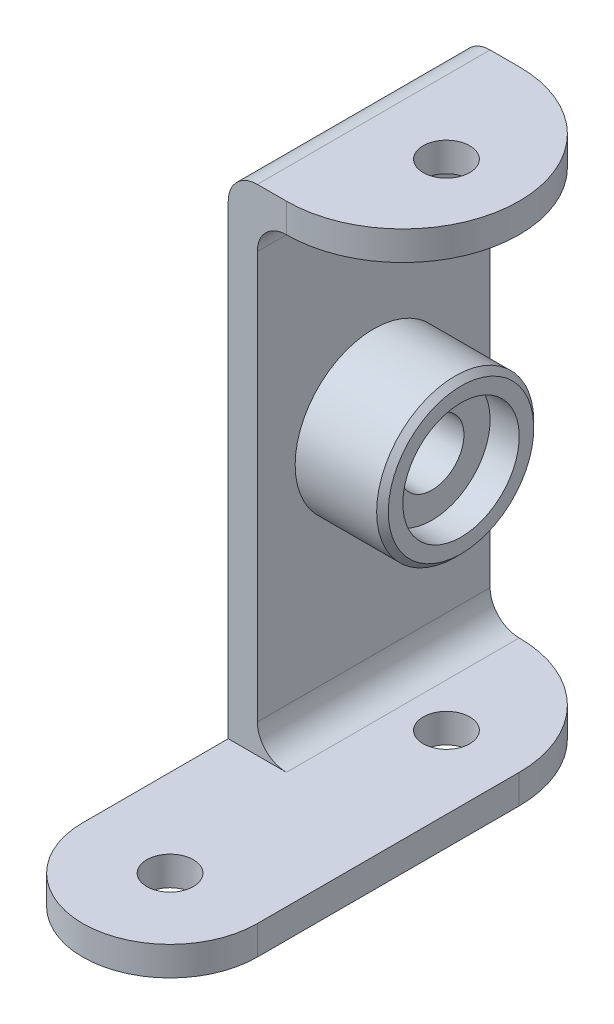
ISO-10303-21;
HEADER;
FILE_DESCRIPTION(('STEP AP214'),'2;1');
FILE_NAME('part.step','',(''),(''),'','','');
FILE_SCHEMA(('AUTOMOTIVE_DESIGN { 1 0 10303 214 1 1 1 1 }'));
ENDSEC;
DATA;
#1=APPLICATION_CONTEXT('core data for automotive mechanical design processes');
#2=APPLICATION_PROTOCOL_DEFINITION('international standard','automotive_design',2000,#1);
#3=PRODUCT_CONTEXT('',#1,'mechanical');
#4=PRODUCT('Part','Part','',(#3));
#5=PRODUCT_RELATED_PRODUCT_CATEGORY('part','',(#4));
#6=PRODUCT_DEFINITION_FORMATION('','',#4);
#7=PRODUCT_DEFINITION_CONTEXT('part definition',#1,'design');
#8=PRODUCT_DEFINITION('design','',#6,#7);
#9=PRODUCT_DEFINITION_SHAPE('','',#8);
#10=(LENGTH_UNIT() NAMED_UNIT(*) SI_UNIT(.MILLI.,.METRE.));
#11=(NAMED_UNIT(*) PLANE_ANGLE_UNIT() SI_UNIT($,.RADIAN.));
#12=(NAMED_UNIT(*) SI_UNIT($,.STERADIAN.) SOLID_ANGLE_UNIT());
#13=UNCERTAINTY_MEASURE_WITH_UNIT(LENGTH_MEASURE(1.E-05),#10,'distance_accuracy_value','');
#14=(GEOMETRIC_REPRESENTATION_CONTEXT(3) GLOBAL_UNCERTAINTY_ASSIGNED_CONTEXT((#13)) GLOBAL_UNIT_ASSIGNED_CONTEXT((#10,
#11,#12)) REPRESENTATION_CONTEXT('',''));
#15=CARTESIAN_POINT('',(0.,0.,0.));
#16=DIRECTION('',(0.,0.,1.));
#17=DIRECTION('',(1.,0.,0.));
#18=AXIS2_PLACEMENT_3D('',#15,#16,#17);
#19=CARTESIAN_POINT('',(-30.,0.,0.));
#20=DIRECTION('',(1.,0.,0.));
#21=DIRECTION('',(0.,-1.,0.));
#22=AXIS2_PLACEMENT_3D('',#19,#20,#21);
#23=CYLINDRICAL_SURFACE('',#22,5.5);
#24=CARTESIAN_POINT('',(-30.,0.,0.));
#25=DIRECTION('',(-1.,0.,0.));
#26=DIRECTION('',(0.,-1.,0.));
#27=AXIS2_PLACEMENT_3D('',#24,#25,#26);
#28=CIRCLE('',#27,5.5);
#29=CARTESIAN_POINT('',(-30.,-5.5,0.));
#30=VERTEX_POINT('',#29);
#31=EDGE_CURVE('E196',#30,#30,#28,.T.);
#32=ORIENTED_EDGE('',*,*,#31,.T.);
#33=EDGE_LOOP('',(#32));
#34=FACE_BOUND('',#33,.T.);
#35=CARTESIAN_POINT('',(-15.,0.,0.));
#36=DIRECTION('',(-1.,0.,0.));
#37=DIRECTION('',(0.,-1.,0.));
#38=AXIS2_PLACEMENT_3D('',#35,#36,#37);
#39=CIRCLE('',#38,5.5);
#40=CARTESIAN_POINT('',(-15.,-5.5,0.));
#41=VERTEX_POINT('',#40);
#42=EDGE_CURVE('E49',#41,#41,#39,.F.);
#43=ORIENTED_EDGE('',*,*,#42,.T.);
#44=EDGE_LOOP('',(#43));
#45=FACE_BOUND('',#44,.T.);
#46=ADVANCED_FACE('F45',(#34,#45),#23,.F.);
#47=CARTESIAN_POINT('',(-15.,-40.,45.));
#48=DIRECTION('',(0.,1.,0.));
#49=DIRECTION('',(0.,0.,1.));
#50=AXIS2_PLACEMENT_3D('',#47,#48,#49);
#51=CYLINDRICAL_SURFACE('',#50,15.);
#52=DIRECTION('',(0.,-1.,0.));
#53=VECTOR('',#52,1.);
#54=CARTESIAN_POINT('',(-30.,-40.,45.));
#55=LINE('',#54,#53);
#56=CARTESIAN_POINT('',(-30.,-40.,45.));
#57=VERTEX_POINT('',#56);
#58=CARTESIAN_POINT('',(-30.,-45.,45.));
#59=VERTEX_POINT('',#58);
#60=EDGE_CURVE('E326',#57,#59,#55,.T.);
#61=ORIENTED_EDGE('',*,*,#60,.T.);
#62=CARTESIAN_POINT('',(-15.,-45.,45.));
#63=DIRECTION('',(0.,-1.,0.));
#64=DIRECTION('',(0.,0.,1.));
#65=AXIS2_PLACEMENT_3D('',#62,#63,#64);
#66=CIRCLE('',#65,15.);
#67=CARTESIAN_POINT('',(0.,-45.,45.));
#68=VERTEX_POINT('',#67);
#69=EDGE_CURVE('E11',#59,#68,#66,.F.);
#70=ORIENTED_EDGE('',*,*,#69,.T.);
#71=DIRECTION('',(0.,1.,0.));
#72=VECTOR('',#71,1.);
#73=CARTESIAN_POINT('',(0.,-40.,45.));
#74=LINE('',#73,#72);
#75=CARTESIAN_POINT('',(0.,-40.,45.));
#76=VERTEX_POINT('',#75);
#77=EDGE_CURVE('E336',#68,#76,#74,.T.);
#78=ORIENTED_EDGE('',*,*,#77,.T.);
#79=CARTESIAN_POINT('',(-15.,-40.,45.));
#80=DIRECTION('',(0.,1.,0.));
#81=DIRECTION('',(-1.,0.,0.));
#82=AXIS2_PLACEMENT_3D('',#79,#80,#81);
#83=CIRCLE('',#82,15.);
#84=EDGE_CURVE('E55',#76,#57,#83,.F.);
#85=ORIENTED_EDGE('',*,*,#84,.T.);
#86=EDGE_LOOP('',(#61,#70,#78,#85));
#87=FACE_BOUND('',#86,.T.);
#88=ADVANCED_FACE('F47',(#87),#51,.T.);
#89=CARTESIAN_POINT('',(-20.,-45.,0.));
#90=DIRECTION('',(0.,-1.,0.));
#91=DIRECTION('',(-1.,0.,0.));
#92=AXIS2_PLACEMENT_3D('',#89,#90,#91);
#93=CYLINDRICAL_SURFACE('',#92,20.);
#94=CARTESIAN_POINT('',(-20.,-45.,0.));
#95=DIRECTION('',(0.,-1.,0.));
#96=DIRECTION('',(0.,0.,1.));
#97=AXIS2_PLACEMENT_3D('',#94,#95,#96);
#98=CIRCLE('',#97,20.);
#99=CARTESIAN_POINT('',(0.,-45.,0.));
#100=VERTEX_POINT('',#99);
#101=CARTESIAN_POINT('',(-20.,-45.,-20.));
#102=VERTEX_POINT('',#101);
#103=EDGE_CURVE('E318',#100,#102,#98,.F.);
#104=ORIENTED_EDGE('',*,*,#103,.T.);
#105=DIRECTION('',(0.,1.,0.));
#106=VECTOR('',#105,1.);
#107=CARTESIAN_POINT('',(-20.,-45.,-20.));
#108=LINE('',#107,#106);
#109=CARTESIAN_POINT('',(-20.,-40.,-20.));
#110=VERTEX_POINT('',#109);
#111=EDGE_CURVE('E314',#102,#110,#108,.T.);
#112=ORIENTED_EDGE('',*,*,#111,.T.);
#113=CARTESIAN_POINT('',(-20.,-40.,0.));
#114=DIRECTION('',(0.,1.,0.));
#115=DIRECTION('',(-1.,0.,0.));
#116=AXIS2_PLACEMENT_3D('',#113,#114,#115);
#117=CIRCLE('',#116,20.);
#118=CARTESIAN_POINT('',(0.,-40.,0.));
#119=VERTEX_POINT('',#118);
#120=EDGE_CURVE('E322',#110,#119,#117,.F.);
#121=ORIENTED_EDGE('',*,*,#120,.T.);
#122=DIRECTION('',(0.,-1.,0.));
#123=VECTOR('',#122,1.);
#124=CARTESIAN_POINT('',(0.,-45.,0.));
#125=LINE('',#124,#123);
#126=EDGE_CURVE('E177',#119,#100,#125,.T.);
#127=ORIENTED_EDGE('',*,*,#126,.T.);
#128=EDGE_LOOP('',(#104,#112,#121,#127));
#129=FACE_BOUND('',#128,.T.);
#130=ADVANCED_FACE('F390',(#129),#93,.T.);
#131=CARTESIAN_POINT('',(-20.,45.,0.));
#132=DIRECTION('',(0.,-1.,0.));
#133=DIRECTION('',(-1.,0.,0.));
#134=AXIS2_PLACEMENT_3D('',#131,#132,#133);
#135=CYLINDRICAL_SURFACE('',#134,20.);
#136=DIRECTION('',(0.,-1.,0.));
#137=VECTOR('',#136,1.);
#138=CARTESIAN_POINT('',(-20.,35.,20.));
#139=LINE('',#138,#137);
#140=CARTESIAN_POINT('',(-20.,45.,20.));
#141=VERTEX_POINT('',#140);
#142=CARTESIAN_POINT('',(-20.,40.,20.));
#143=VERTEX_POINT('',#142);
#144=EDGE_CURVE('E298',#141,#143,#139,.T.);
#145=ORIENTED_EDGE('',*,*,#144,.T.);
#146=CARTESIAN_POINT('',(-20.,40.,0.));
#147=DIRECTION('',(0.,-1.,0.));
#148=DIRECTION('',(0.,0.,1.));
#149=AXIS2_PLACEMENT_3D('',#146,#147,#148);
#150=CIRCLE('',#149,20.);
#151=CARTESIAN_POINT('',(-20.,40.,-20.));
#152=VERTEX_POINT('',#151);
#153=EDGE_CURVE('E310',#143,#152,#150,.F.);
#154=ORIENTED_EDGE('',*,*,#153,.T.);
#155=DIRECTION('',(0.,1.,0.));
#156=VECTOR('',#155,1.);
#157=CARTESIAN_POINT('',(-20.,45.,-20.));
#158=LINE('',#157,#156);
#159=CARTESIAN_POINT('',(-20.,45.,-20.));
#160=VERTEX_POINT('',#159);
#161=EDGE_CURVE('E302',#152,#160,#158,.T.);
#162=ORIENTED_EDGE('',*,*,#161,.T.);
#163=CARTESIAN_POINT('',(-20.,45.,0.));
#164=DIRECTION('',(0.,1.,0.));
#165=DIRECTION('',(0.,0.,-1.));
#166=AXIS2_PLACEMENT_3D('',#163,#164,#165);
#167=CIRCLE('',#166,20.);
#168=EDGE_CURVE('E306',#160,#141,#167,.F.);
#169=ORIENTED_EDGE('',*,*,#168,.T.);
#170=EDGE_LOOP('',(#145,#154,#162,#169));
#171=FACE_BOUND('',#170,.T.);
#172=ADVANCED_FACE('F448',(#171),#135,.T.);
#173=CARTESIAN_POINT('',(0.,40.,20.));
#174=DIRECTION('',(0.,1.,0.));
#175=DIRECTION('',(0.,0.,1.));
#176=AXIS2_PLACEMENT_3D('',#173,#174,#175);
#177=PLANE('',#176);
#178=CARTESIAN_POINT('',(-12.5,40.,0.));
#179=DIRECTION('',(0.,-1.,0.));
#180=DIRECTION('',(0.,0.,1.));
#181=AXIS2_PLACEMENT_3D('',#178,#179,#180);
#182=CIRCLE('',#181,4.);
#183=CARTESIAN_POINT('',(-12.5,40.,4.));
#184=VERTEX_POINT('',#183);
#185=EDGE_CURVE('E192',#184,#184,#182,.T.);
#186=ORIENTED_EDGE('',*,*,#185,.F.);
#187=EDGE_LOOP('',(#186));
#188=FACE_BOUND('',#187,.T.);
#189=DIRECTION('',(0.,0.,-1.));
#190=VECTOR('',#189,1.);
#191=CARTESIAN_POINT('',(-20.,40.,20.));
#192=LINE('',#191,#190);
#193=EDGE_CURVE('E282',#143,#152,#192,.T.);
#194=ORIENTED_EDGE('',*,*,#193,.T.);
#195=ORIENTED_EDGE('',*,*,#153,.F.);
#196=EDGE_LOOP('',(#194,#195));
#197=FACE_BOUND('',#196,.T.);
#198=ADVANCED_FACE('F444',(#188,#197),#177,.F.);
#199=CARTESIAN_POINT('',(-20.,35.,20.));
#200=DIRECTION('',(0.,0.,-1.));
#201=DIRECTION('',(1.,0.,0.));
#202=AXIS2_PLACEMENT_3D('',#199,#200,#201);
#203=CYLINDRICAL_SURFACE('',#202,5.);
#204=CARTESIAN_POINT('',(-20.,35.,-20.));
#205=DIRECTION('',(0.,0.,1.));
#206=DIRECTION('',(1.,0.,0.));
#207=AXIS2_PLACEMENT_3D('',#204,#205,#206);
#208=CIRCLE('',#207,5.);
#209=CARTESIAN_POINT('',(-25.,35.,-20.));
#210=VERTEX_POINT('',#209);
#211=EDGE_CURVE('E200',#152,#210,#208,.T.);
#212=ORIENTED_EDGE('',*,*,#211,.F.);
#213=ORIENTED_EDGE('',*,*,#193,.F.);
#214=CARTESIAN_POINT('',(-20.,35.,20.));
#215=DIRECTION('',(0.,0.,1.));
#216=DIRECTION('',(1.,0.,0.));
#217=AXIS2_PLACEMENT_3D('',#214,#215,#216);
#218=CIRCLE('',#217,5.);
#219=CARTESIAN_POINT('',(-25.,35.,20.));
#220=VERTEX_POINT('',#219);
#221=EDGE_CURVE('E201',#143,#220,#218,.T.);
#222=ORIENTED_EDGE('',*,*,#221,.T.);
#223=DIRECTION('',(0.,0.,-1.));
#224=VECTOR('',#223,1.);
#225=CARTESIAN_POINT('',(-25.,35.,20.));
#226=LINE('',#225,#224);
#227=EDGE_CURVE('E278',#220,#210,#226,.T.);
#228=ORIENTED_EDGE('',*,*,#227,.T.);
#229=EDGE_LOOP('',(#212,#213,#222,#228));
#230=FACE_BOUND('',#229,.T.);
#231=ADVANCED_FACE('F440',(#230),#203,.F.);
#232=CARTESIAN_POINT('',(-25.,35.,20.));
#233=DIRECTION('',(-1.,0.,0.));
#234=DIRECTION('',(0.,0.,-1.));
#235=AXIS2_PLACEMENT_3D('',#232,#233,#234);
#236=PLANE('',#235);
#237=CARTESIAN_POINT('',(-25.,0.,0.));
#238=DIRECTION('',(1.,0.,0.));
#239=DIRECTION('',(0.,0.,-1.));
#240=AXIS2_PLACEMENT_3D('',#237,#238,#239);
#241=CIRCLE('',#240,13.5);
#242=CARTESIAN_POINT('',(-25.,0.,-13.5));
#243=VERTEX_POINT('',#242);
#244=EDGE_CURVE('E286',#243,#243,#241,.F.);
#245=ORIENTED_EDGE('',*,*,#244,.T.);
#246=EDGE_LOOP('',(#245));
#247=FACE_BOUND('',#246,.T.);
#248=DIRECTION('',(0.,-1.,0.));
#249=VECTOR('',#248,1.);
#250=CARTESIAN_POINT('',(-25.,35.,-20.));
#251=LINE('',#250,#249);
#252=CARTESIAN_POINT('',(-25.,-35.,-20.));
#253=VERTEX_POINT('',#252);
#254=EDGE_CURVE('E231',#210,#253,#251,.T.);
#255=ORIENTED_EDGE('',*,*,#254,.F.);
#256=ORIENTED_EDGE('',*,*,#227,.F.);
#257=DIRECTION('',(0.,-1.,0.));
#258=VECTOR('',#257,1.);
#259=CARTESIAN_POINT('',(-25.,35.,20.));
#260=LINE('',#259,#258);
#261=CARTESIAN_POINT('',(-25.,-35.,20.));
#262=VERTEX_POINT('',#261);
#263=EDGE_CURVE('E205',#220,#262,#260,.T.);
#264=ORIENTED_EDGE('',*,*,#263,.T.);
#265=DIRECTION('',(0.,0.,-1.));
#266=VECTOR('',#265,1.);
#267=CARTESIAN_POINT('',(-25.,-35.,20.));
#268=LINE('',#267,#266);
#269=EDGE_CURVE('E274',#262,#253,#268,.T.);
#270=ORIENTED_EDGE('',*,*,#269,.T.);
#271=EDGE_LOOP('',(#255,#256,#264,#270));
#272=FACE_BOUND('',#271,.T.);
#273=ADVANCED_FACE('F436',(#247,#272),#236,.F.);
#274=CARTESIAN_POINT('',(-20.,-35.,20.));
#275=DIRECTION('',(0.,0.,-1.));
#276=DIRECTION('',(1.,0.,0.));
#277=AXIS2_PLACEMENT_3D('',#274,#275,#276);
#278=CYLINDRICAL_SURFACE('',#277,5.);
#279=CARTESIAN_POINT('',(-20.,-35.,-20.));
#280=DIRECTION('',(0.,0.,1.));
#281=DIRECTION('',(1.,0.,0.));
#282=AXIS2_PLACEMENT_3D('',#279,#280,#281);
#283=CIRCLE('',#282,5.);
#284=EDGE_CURVE('E235',#253,#110,#283,.T.);
#285=ORIENTED_EDGE('',*,*,#284,.F.);
#286=ORIENTED_EDGE('',*,*,#269,.F.);
#287=CARTESIAN_POINT('',(-20.,-35.,20.));
#288=DIRECTION('',(0.,0.,1.));
#289=DIRECTION('',(1.,0.,0.));
#290=AXIS2_PLACEMENT_3D('',#287,#288,#289);
#291=CIRCLE('',#290,5.);
#292=CARTESIAN_POINT('',(-20.,-40.,20.));
#293=VERTEX_POINT('',#292);
#294=EDGE_CURVE('E210',#262,#293,#291,.T.);
#295=ORIENTED_EDGE('',*,*,#294,.T.);
#296=DIRECTION('',(0.,0.,-1.));
#297=VECTOR('',#296,1.);
#298=CARTESIAN_POINT('',(-20.,-40.,20.));
#299=LINE('',#298,#297);
#300=EDGE_CURVE('E271',#293,#110,#299,.T.);
#301=ORIENTED_EDGE('',*,*,#300,.T.);
#302=EDGE_LOOP('',(#285,#286,#295,#301));
#303=FACE_BOUND('',#302,.T.);
#304=ADVANCED_FACE('F432',(#303),#278,.F.);
#305=CARTESIAN_POINT('',(-20.,-40.,20.));
#306=DIRECTION('',(0.,-1.,0.));
#307=DIRECTION('',(-1.,0.,0.));
#308=AXIS2_PLACEMENT_3D('',#305,#306,#307);
#309=PLANE('',#308);
#310=CARTESIAN_POINT('',(-15.,-40.,45.));
#311=DIRECTION('',(0.,-1.,0.));
#312=DIRECTION('',(1.,0.,0.));
#313=AXIS2_PLACEMENT_3D('',#310,#311,#312);
#314=CIRCLE('',#313,3.99999999999999);
#315=CARTESIAN_POINT('',(-11.,-40.,45.));
#316=VERTEX_POINT('',#315);
#317=EDGE_CURVE('E333',#316,#316,#314,.T.);
#318=ORIENTED_EDGE('',*,*,#317,.T.);
#319=EDGE_LOOP('',(#318));
#320=FACE_BOUND('',#319,.T.);
#321=CARTESIAN_POINT('',(-12.5,-40.,0.));
#322=DIRECTION('',(0.,-1.,0.));
#323=DIRECTION('',(1.,0.,0.));
#324=AXIS2_PLACEMENT_3D('',#321,#322,#323);
#325=CIRCLE('',#324,4.00000000000001);
#326=CARTESIAN_POINT('',(-8.50000000000001,-40.,0.));
#327=VERTEX_POINT('',#326);
#328=EDGE_CURVE('E181',#327,#327,#325,.T.);
#329=ORIENTED_EDGE('',*,*,#328,.T.);
#330=EDGE_LOOP('',(#329));
#331=FACE_BOUND('',#330,.T.);
#332=DIRECTION('',(0.,0.,1.));
#333=VECTOR('',#332,1.);
#334=CARTESIAN_POINT('',(0.,-40.,-20.001));
#335=LINE('',#334,#333);
#336=EDGE_CURVE('E69',#119,#76,#335,.T.);
#337=ORIENTED_EDGE('',*,*,#336,.F.);
#338=ORIENTED_EDGE('',*,*,#120,.F.);
#339=ORIENTED_EDGE('',*,*,#300,.F.);
#340=DIRECTION('',(1.,0.,0.));
#341=VECTOR('',#340,1.);
#342=CARTESIAN_POINT('',(-20.,-40.,20.));
#343=LINE('',#342,#341);
#344=CARTESIAN_POINT('',(-30.,-40.,20.));
#345=VERTEX_POINT('',#344);
#346=EDGE_CURVE('E153',#345,#293,#343,.T.);
#347=ORIENTED_EDGE('',*,*,#346,.F.);
#348=DIRECTION('',(0.,0.,-1.));
#349=VECTOR('',#348,1.);
#350=CARTESIAN_POINT('',(-30.,-40.,60.));
#351=LINE('',#350,#349);
#352=EDGE_CURVE('E148',#57,#345,#351,.T.);
#353=ORIENTED_EDGE('',*,*,#352,.F.);
#354=ORIENTED_EDGE('',*,*,#84,.F.);
#355=EDGE_LOOP('',(#337,#338,#339,#347,#353,#354));
#356=FACE_BOUND('',#355,.T.);
#357=ADVANCED_FACE('F345',(#320,#331,#356),#309,.F.);
#358=CARTESIAN_POINT('',(-25.,-45.,20.));
#359=DIRECTION('',(0.,1.,0.));
#360=DIRECTION('',(0.,0.,1.));
#361=AXIS2_PLACEMENT_3D('',#358,#359,#360);
#362=PLANE('',#361);
#363=CARTESIAN_POINT('',(-15.,-45.,45.));
#364=DIRECTION('',(0.,-1.,0.));
#365=DIRECTION('',(0.,0.,1.));
#366=AXIS2_PLACEMENT_3D('',#363,#364,#365);
#367=CIRCLE('',#366,3.99999999999999);
#368=CARTESIAN_POINT('',(-15.,-45.,49.));
#369=VERTEX_POINT('',#368);
#370=EDGE_CURVE('E163',#369,#369,#367,.T.);
#371=ORIENTED_EDGE('',*,*,#370,.F.);
#372=EDGE_LOOP('',(#371));
#373=FACE_BOUND('',#372,.T.);
#374=DIRECTION('',(0.,0.,-1.));
#375=VECTOR('',#374,1.);
#376=CARTESIAN_POINT('',(-30.,-45.,60.));
#377=LINE('',#376,#375);
#378=CARTESIAN_POINT('',(-30.,-45.,20.));
#379=VERTEX_POINT('',#378);
#380=EDGE_CURVE('E147',#59,#379,#377,.T.);
#381=ORIENTED_EDGE('',*,*,#380,.T.);
#382=DIRECTION('',(-1.,0.,0.));
#383=VECTOR('',#382,1.);
#384=CARTESIAN_POINT('',(0.,-45.,20.));
#385=LINE('',#384,#383);
#386=CARTESIAN_POINT('',(-25.,-45.,20.));
#387=VERTEX_POINT('',#386);
#388=EDGE_CURVE('E154',#387,#379,#385,.T.);
#389=ORIENTED_EDGE('',*,*,#388,.F.);
#390=DIRECTION('',(0.,0.,-1.));
#391=VECTOR('',#390,1.);
#392=CARTESIAN_POINT('',(-25.,-45.,20.));
#393=LINE('',#392,#391);
#394=CARTESIAN_POINT('',(-25.,-45.,-20.));
#395=VERTEX_POINT('',#394);
#396=EDGE_CURVE('E268',#387,#395,#393,.T.);
#397=ORIENTED_EDGE('',*,*,#396,.T.);
#398=DIRECTION('',(-1.,0.,0.));
#399=VECTOR('',#398,1.);
#400=CARTESIAN_POINT('',(-25.,-45.,-20.));
#401=LINE('',#400,#399);
#402=EDGE_CURVE('E239',#102,#395,#401,.T.);
#403=ORIENTED_EDGE('',*,*,#402,.F.);
#404=ORIENTED_EDGE('',*,*,#103,.F.);
#405=DIRECTION('',(0.,0.,1.));
#406=VECTOR('',#405,1.);
#407=CARTESIAN_POINT('',(0.,-45.,-20.001));
#408=LINE('',#407,#406);
#409=EDGE_CURVE('E62',#100,#68,#408,.T.);
#410=ORIENTED_EDGE('',*,*,#409,.T.);
#411=ORIENTED_EDGE('',*,*,#69,.F.);
#412=EDGE_LOOP('',(#381,#389,#397,#403,#404,#410,#411));
#413=FACE_BOUND('',#412,.T.);
#414=CARTESIAN_POINT('',(-12.5,-45.,0.));
#415=DIRECTION('',(0.,-1.,0.));
#416=DIRECTION('',(0.,0.,1.));
#417=AXIS2_PLACEMENT_3D('',#414,#415,#416);
#418=CIRCLE('',#417,4.00000000000001);
#419=CARTESIAN_POINT('',(-12.5,-45.,4.00000000000001));
#420=VERTEX_POINT('',#419);
#421=EDGE_CURVE('E187',#420,#420,#418,.T.);
#422=ORIENTED_EDGE('',*,*,#421,.F.);
#423=EDGE_LOOP('',(#422));
#424=FACE_BOUND('',#423,.T.);
#425=ADVANCED_FACE('F165',(#373,#413,#424),#362,.F.);
#426=CARTESIAN_POINT('',(-25.,-40.,20.));
#427=DIRECTION('',(0.,0.,-1.));
#428=DIRECTION('',(1.,0.,0.));
#429=AXIS2_PLACEMENT_3D('',#426,#427,#428);
#430=CYLINDRICAL_SURFACE('',#429,5.);
#431=CARTESIAN_POINT('',(-25.,-40.,-20.));
#432=DIRECTION('',(0.,0.,-1.));
#433=DIRECTION('',(1.,0.,0.));
#434=AXIS2_PLACEMENT_3D('',#431,#432,#433);
#435=CIRCLE('',#434,5.);
#436=CARTESIAN_POINT('',(-30.,-40.,-20.));
#437=VERTEX_POINT('',#436);
#438=EDGE_CURVE('E243',#395,#437,#435,.T.);
#439=ORIENTED_EDGE('',*,*,#438,.F.);
#440=ORIENTED_EDGE('',*,*,#396,.F.);
#441=CARTESIAN_POINT('',(-25.,-40.,20.));
#442=DIRECTION('',(0.,0.,-1.));
#443=DIRECTION('',(1.,0.,0.));
#444=AXIS2_PLACEMENT_3D('',#441,#442,#443);
#445=CIRCLE('',#444,5.);
#446=EDGE_CURVE('E159',#387,#345,#445,.T.);
#447=ORIENTED_EDGE('',*,*,#446,.T.);
#448=DIRECTION('',(0.,0.,-1.));
#449=VECTOR('',#448,1.);
#450=CARTESIAN_POINT('',(-30.,-40.,20.));
#451=LINE('',#450,#449);
#452=EDGE_CURVE('E264',#345,#437,#451,.T.);
#453=ORIENTED_EDGE('',*,*,#452,.T.);
#454=EDGE_LOOP('',(#439,#440,#447,#453));
#455=FACE_BOUND('',#454,.T.);
#456=ADVANCED_FACE('F422',(#455),#430,.T.);
#457=CARTESIAN_POINT('',(-30.,40.,20.));
#458=DIRECTION('',(1.,0.,0.));
#459=DIRECTION('',(0.,0.,1.));
#460=AXIS2_PLACEMENT_3D('',#457,#458,#459);
#461=PLANE('',#460);
#462=ORIENTED_EDGE('',*,*,#31,.F.);
#463=EDGE_LOOP('',(#462));
#464=FACE_BOUND('',#463,.T.);
#465=DIRECTION('',(0.,1.,0.));
#466=VECTOR('',#465,1.);
#467=CARTESIAN_POINT('',(-30.,40.,-20.));
#468=LINE('',#467,#466);
#469=CARTESIAN_POINT('',(-30.,40.,-20.));
#470=VERTEX_POINT('',#469);
#471=EDGE_CURVE('E247',#437,#470,#468,.T.);
#472=ORIENTED_EDGE('',*,*,#471,.F.);
#473=ORIENTED_EDGE('',*,*,#452,.F.);
#474=DIRECTION('',(0.,1.,0.));
#475=VECTOR('',#474,1.);
#476=CARTESIAN_POINT('',(-30.,40.,20.));
#477=LINE('',#476,#475);
#478=CARTESIAN_POINT('',(-30.,40.,20.));
#479=VERTEX_POINT('',#478);
#480=EDGE_CURVE('E216',#345,#479,#477,.T.);
#481=ORIENTED_EDGE('',*,*,#480,.T.);
#482=DIRECTION('',(0.,0.,-1.));
#483=VECTOR('',#482,1.);
#484=CARTESIAN_POINT('',(-30.,40.,20.));
#485=LINE('',#484,#483);
#486=EDGE_CURVE('E260',#479,#470,#485,.T.);
#487=ORIENTED_EDGE('',*,*,#486,.T.);
#488=EDGE_LOOP('',(#472,#473,#481,#487));
#489=FACE_BOUND('',#488,.T.);
#490=ADVANCED_FACE('F418',(#464,#489),#461,.F.);
#491=CARTESIAN_POINT('',(-25.,40.,20.));
#492=DIRECTION('',(0.,0.,-1.));
#493=DIRECTION('',(1.,0.,0.));
#494=AXIS2_PLACEMENT_3D('',#491,#492,#493);
#495=CYLINDRICAL_SURFACE('',#494,5.);
#496=CARTESIAN_POINT('',(-25.,40.,-20.));
#497=DIRECTION('',(0.,0.,-1.));
#498=DIRECTION('',(1.,0.,0.));
#499=AXIS2_PLACEMENT_3D('',#496,#497,#498);
#500=CIRCLE('',#499,5.);
#501=CARTESIAN_POINT('',(-25.,45.,-20.));
#502=VERTEX_POINT('',#501);
#503=EDGE_CURVE('E251',#470,#502,#500,.T.);
#504=ORIENTED_EDGE('',*,*,#503,.F.);
#505=ORIENTED_EDGE('',*,*,#486,.F.);
#506=CARTESIAN_POINT('',(-25.,40.,20.));
#507=DIRECTION('',(0.,0.,-1.));
#508=DIRECTION('',(1.,0.,0.));
#509=AXIS2_PLACEMENT_3D('',#506,#507,#508);
#510=CIRCLE('',#509,5.);
#511=CARTESIAN_POINT('',(-25.,45.,20.));
#512=VERTEX_POINT('',#511);
#513=EDGE_CURVE('E220',#479,#512,#510,.T.);
#514=ORIENTED_EDGE('',*,*,#513,.T.);
#515=DIRECTION('',(0.,0.,-1.));
#516=VECTOR('',#515,1.);
#517=CARTESIAN_POINT('',(-25.,45.,20.));
#518=LINE('',#517,#516);
#519=EDGE_CURVE('E227',#512,#502,#518,.T.);
#520=ORIENTED_EDGE('',*,*,#519,.T.);
#521=EDGE_LOOP('',(#504,#505,#514,#520));
#522=FACE_BOUND('',#521,.T.);
#523=ADVANCED_FACE('F414',(#522),#495,.T.);
#524=CARTESIAN_POINT('',(0.,45.,20.));
#525=DIRECTION('',(0.,-1.,0.));
#526=DIRECTION('',(0.,0.,-1.));
#527=AXIS2_PLACEMENT_3D('',#524,#525,#526);
#528=PLANE('',#527);
#529=CARTESIAN_POINT('',(-12.5,45.,0.));
#530=DIRECTION('',(0.,-1.,0.));
#531=DIRECTION('',(1.,0.,0.));
#532=AXIS2_PLACEMENT_3D('',#529,#530,#531);
#533=CIRCLE('',#532,4.);
#534=CARTESIAN_POINT('',(-8.49999999999999,45.,0.));
#535=VERTEX_POINT('',#534);
#536=EDGE_CURVE('E188',#535,#535,#533,.T.);
#537=ORIENTED_EDGE('',*,*,#536,.T.);
#538=EDGE_LOOP('',(#537));
#539=FACE_BOUND('',#538,.T.);
#540=DIRECTION('',(1.,0.,0.));
#541=VECTOR('',#540,1.);
#542=CARTESIAN_POINT('',(0.,45.,-20.));
#543=LINE('',#542,#541);
#544=EDGE_CURVE('E206',#502,#160,#543,.T.);
#545=ORIENTED_EDGE('',*,*,#544,.F.);
#546=ORIENTED_EDGE('',*,*,#519,.F.);
#547=DIRECTION('',(1.,0.,0.));
#548=VECTOR('',#547,1.);
#549=CARTESIAN_POINT('',(0.,45.,20.));
#550=LINE('',#549,#548);
#551=EDGE_CURVE('E224',#512,#141,#550,.T.);
#552=ORIENTED_EDGE('',*,*,#551,.T.);
#553=ORIENTED_EDGE('',*,*,#168,.F.);
#554=EDGE_LOOP('',(#545,#546,#552,#553));
#555=FACE_BOUND('',#554,.T.);
#556=ADVANCED_FACE('F408',(#539,#555),#528,.F.);
#557=CARTESIAN_POINT('',(-20.,35.,20.));
#558=DIRECTION('',(0.,0.,-1.));
#559=DIRECTION('',(1.,0.,0.));
#560=AXIS2_PLACEMENT_3D('',#557,#558,#559);
#561=PLANE('',#560);
#562=ORIENTED_EDGE('',*,*,#294,.F.);
#563=ORIENTED_EDGE('',*,*,#263,.F.);
#564=ORIENTED_EDGE('',*,*,#221,.F.);
#565=ORIENTED_EDGE('',*,*,#144,.F.);
#566=ORIENTED_EDGE('',*,*,#551,.F.);
#567=ORIENTED_EDGE('',*,*,#513,.F.);
#568=ORIENTED_EDGE('',*,*,#480,.F.);
#569=ORIENTED_EDGE('',*,*,#346,.T.);
#570=EDGE_LOOP('',(#562,#563,#564,#565,#566,#567,#568,#569));
#571=FACE_BOUND('',#570,.T.);
#572=ADVANCED_FACE('F405',(#571),#561,.F.);
#573=CARTESIAN_POINT('',(-20.,35.,-20.));
#574=DIRECTION('',(0.,0.,-1.));
#575=DIRECTION('',(1.,0.,0.));
#576=AXIS2_PLACEMENT_3D('',#573,#574,#575);
#577=PLANE('',#576);
#578=ORIENTED_EDGE('',*,*,#402,.T.);
#579=ORIENTED_EDGE('',*,*,#438,.T.);
#580=ORIENTED_EDGE('',*,*,#471,.T.);
#581=ORIENTED_EDGE('',*,*,#503,.T.);
#582=ORIENTED_EDGE('',*,*,#544,.T.);
#583=ORIENTED_EDGE('',*,*,#161,.F.);
#584=ORIENTED_EDGE('',*,*,#211,.T.);
#585=ORIENTED_EDGE('',*,*,#254,.T.);
#586=ORIENTED_EDGE('',*,*,#284,.T.);
#587=ORIENTED_EDGE('',*,*,#111,.F.);
#588=EDGE_LOOP('',(#578,#579,#580,#581,#582,#583,#584,#585,#586,#587));
#589=FACE_BOUND('',#588,.T.);
#590=ADVANCED_FACE('F403',(#589),#577,.T.);
#591=CARTESIAN_POINT('',(-9.99999999999999,0.,0.));
#592=DIRECTION('',(-1.,0.,0.));
#593=DIRECTION('',(0.,1.,0.));
#594=AXIS2_PLACEMENT_3D('',#591,#592,#593);
#595=CYLINDRICAL_SURFACE('',#594,13.5);
#596=CARTESIAN_POINT('',(-11.,0.,0.));
#597=DIRECTION('',(-1.,0.,0.));
#598=DIRECTION('',(0.,-1.,0.));
#599=AXIS2_PLACEMENT_3D('',#596,#597,#598);
#600=CIRCLE('',#599,13.5);
#601=CARTESIAN_POINT('',(-11.,-13.5,0.));
#602=VERTEX_POINT('',#601);
#603=EDGE_CURVE('E294',#602,#602,#600,.F.);
#604=ORIENTED_EDGE('',*,*,#603,.F.);
#605=EDGE_LOOP('',(#604));
#606=FACE_BOUND('',#605,.T.);
#607=ORIENTED_EDGE('',*,*,#244,.F.);
#608=EDGE_LOOP('',(#607));
#609=FACE_BOUND('',#608,.T.);
#610=ADVANCED_FACE('F399',(#606,#609),#595,.T.);
#611=CARTESIAN_POINT('',(-9.99999999999999,0.,0.));
#612=DIRECTION('',(1.,0.,0.));
#613=DIRECTION('',(0.,-1.,0.));
#614=AXIS2_PLACEMENT_3D('',#611,#612,#613);
#615=PLANE('',#614);
#616=CARTESIAN_POINT('',(-9.99999999999999,0.,0.));
#617=DIRECTION('',(-1.,0.,0.));
#618=DIRECTION('',(0.,-1.,0.));
#619=AXIS2_PLACEMENT_3D('',#616,#617,#618);
#620=CIRCLE('',#619,10.);
#621=CARTESIAN_POINT('',(-10.,-10.,0.));
#622=VERTEX_POINT('',#621);
#623=EDGE_CURVE('E355',#622,#622,#620,.T.);
#624=ORIENTED_EDGE('',*,*,#623,.T.);
#625=EDGE_LOOP('',(#624));
#626=FACE_BOUND('',#625,.T.);
#627=CARTESIAN_POINT('',(-9.99999999999999,0.,0.));
#628=DIRECTION('',(-1.,0.,0.));
#629=DIRECTION('',(0.,-1.,0.));
#630=AXIS2_PLACEMENT_3D('',#627,#628,#629);
#631=CIRCLE('',#630,12.5);
#632=CARTESIAN_POINT('',(-10.,-12.5,0.));
#633=VERTEX_POINT('',#632);
#634=EDGE_CURVE('E290',#633,#633,#631,.T.);
#635=ORIENTED_EDGE('',*,*,#634,.F.);
#636=EDGE_LOOP('',(#635));
#637=FACE_BOUND('',#636,.T.);
#638=ADVANCED_FACE('F395',(#626,#637),#615,.T.);
#639=CARTESIAN_POINT('',(-9.99999999999999,0.,0.));
#640=DIRECTION('',(-1.,0.,0.));
#641=DIRECTION('',(0.,1.,0.));
#642=AXIS2_PLACEMENT_3D('',#639,#640,#641);
#643=CONICAL_SURFACE('',#642,12.5,0.785398163397439);
#644=ORIENTED_EDGE('',*,*,#603,.T.);
#645=EDGE_LOOP('',(#644));
#646=FACE_BOUND('',#645,.T.);
#647=ORIENTED_EDGE('',*,*,#634,.T.);
#648=EDGE_LOOP('',(#647));
#649=FACE_BOUND('',#648,.T.);
#650=ADVANCED_FACE('F398',(#646,#649),#643,.T.);
#651=CARTESIAN_POINT('',(-12.5,35.,0.));
#652=DIRECTION('',(0.,1.,0.));
#653=DIRECTION('',(1.,0.,0.));
#654=AXIS2_PLACEMENT_3D('',#651,#652,#653);
#655=CYLINDRICAL_SURFACE('',#654,4.);
#656=ORIENTED_EDGE('',*,*,#536,.F.);
#657=EDGE_LOOP('',(#656));
#658=FACE_BOUND('',#657,.T.);
#659=ORIENTED_EDGE('',*,*,#185,.T.);
#660=EDGE_LOOP('',(#659));
#661=FACE_BOUND('',#660,.T.);
#662=ADVANCED_FACE('F393',(#658,#661),#655,.F.);
#663=CARTESIAN_POINT('',(-12.5,-50.,0.));
#664=DIRECTION('',(0.,1.,0.));
#665=DIRECTION('',(1.,0.,0.));
#666=AXIS2_PLACEMENT_3D('',#663,#664,#665);
#667=CYLINDRICAL_SURFACE('',#666,4.00000000000001);
#668=ORIENTED_EDGE('',*,*,#328,.F.);
#669=EDGE_LOOP('',(#668));
#670=FACE_BOUND('',#669,.T.);
#671=ORIENTED_EDGE('',*,*,#421,.T.);
#672=EDGE_LOOP('',(#671));
#673=FACE_BOUND('',#672,.T.);
#674=ADVANCED_FACE('F476',(#670,#673),#667,.F.);
#675=CARTESIAN_POINT('',(0.,-40.,-20.001));
#676=DIRECTION('',(1.,0.,0.));
#677=DIRECTION('',(0.,0.,1.));
#678=AXIS2_PLACEMENT_3D('',#675,#676,#677);
#679=PLANE('',#678);
#680=ORIENTED_EDGE('',*,*,#409,.F.);
#681=ORIENTED_EDGE('',*,*,#126,.F.);
#682=ORIENTED_EDGE('',*,*,#336,.T.);
#683=ORIENTED_EDGE('',*,*,#77,.F.);
#684=EDGE_LOOP('',(#680,#681,#682,#683));
#685=FACE_BOUND('',#684,.T.);
#686=ADVANCED_FACE('F474',(#685),#679,.T.);
#687=CARTESIAN_POINT('',(0.,0.,20.));
#688=DIRECTION('',(0.,0.,1.));
#689=DIRECTION('',(-1.,0.,0.));
#690=AXIS2_PLACEMENT_3D('',#687,#688,#689);
#691=PLANE('',#690);
#692=ORIENTED_EDGE('',*,*,#388,.T.);
#693=DIRECTION('',(0.,1.,0.));
#694=VECTOR('',#693,1.);
#695=CARTESIAN_POINT('',(-30.,-40.,20.));
#696=LINE('',#695,#694);
#697=EDGE_CURVE('E142',#379,#345,#696,.T.);
#698=ORIENTED_EDGE('',*,*,#697,.T.);
#699=ORIENTED_EDGE('',*,*,#446,.F.);
#700=EDGE_LOOP('',(#692,#698,#699));
#701=FACE_BOUND('',#700,.T.);
#702=ADVANCED_FACE('F157',(#701),#691,.F.);
#703=CARTESIAN_POINT('',(-30.,-40.,60.));
#704=DIRECTION('',(1.,0.,0.));
#705=DIRECTION('',(0.,0.,1.));
#706=AXIS2_PLACEMENT_3D('',#703,#704,#705);
#707=PLANE('',#706);
#708=ORIENTED_EDGE('',*,*,#352,.T.);
#709=ORIENTED_EDGE('',*,*,#697,.F.);
#710=ORIENTED_EDGE('',*,*,#380,.F.);
#711=ORIENTED_EDGE('',*,*,#60,.F.);
#712=EDGE_LOOP('',(#708,#709,#710,#711));
#713=FACE_BOUND('',#712,.T.);
#714=ADVANCED_FACE('F144',(#713),#707,.F.);
#715=CARTESIAN_POINT('',(-15.,-70.,45.));
#716=DIRECTION('',(0.,1.,0.));
#717=DIRECTION('',(1.,0.,0.));
#718=AXIS2_PLACEMENT_3D('',#715,#716,#717);
#719=CYLINDRICAL_SURFACE('',#718,3.99999999999999);
#720=ORIENTED_EDGE('',*,*,#317,.F.);
#721=EDGE_LOOP('',(#720));
#722=FACE_BOUND('',#721,.T.);
#723=ORIENTED_EDGE('',*,*,#370,.T.);
#724=EDGE_LOOP('',(#723));
#725=FACE_BOUND('',#724,.T.);
#726=ADVANCED_FACE('F374',(#722,#725),#719,.F.);
#727=CARTESIAN_POINT('',(-15.,0.,0.));
#728=DIRECTION('',(1.,0.,0.));
#729=DIRECTION('',(0.,-1.,0.));
#730=AXIS2_PLACEMENT_3D('',#727,#728,#729);
#731=PLANE('',#730);
#732=CARTESIAN_POINT('',(-15.,0.,0.));
#733=DIRECTION('',(-1.,0.,0.));
#734=DIRECTION('',(0.,-1.,0.));
#735=AXIS2_PLACEMENT_3D('',#732,#733,#734);
#736=CIRCLE('',#735,10.);
#737=CARTESIAN_POINT('',(-15.,-10.,0.));
#738=VERTEX_POINT('',#737);
#739=EDGE_CURVE('E359',#738,#738,#736,.T.);
#740=ORIENTED_EDGE('',*,*,#739,.F.);
#741=EDGE_LOOP('',(#740));
#742=FACE_BOUND('',#741,.T.);
#743=ORIENTED_EDGE('',*,*,#42,.F.);
#744=EDGE_LOOP('',(#743));
#745=FACE_BOUND('',#744,.T.);
#746=ADVANCED_FACE('F371',(#742,#745),#731,.T.);
#747=CARTESIAN_POINT('',(-15.,0.,0.));
#748=DIRECTION('',(1.,0.,0.));
#749=DIRECTION('',(0.,-1.,0.));
#750=AXIS2_PLACEMENT_3D('',#747,#748,#749);
#751=CYLINDRICAL_SURFACE('',#750,10.);
#752=ORIENTED_EDGE('',*,*,#739,.T.);
#753=EDGE_LOOP('',(#752));
#754=FACE_BOUND('',#753,.T.);
#755=ORIENTED_EDGE('',*,*,#623,.F.);
#756=EDGE_LOOP('',(#755));
#757=FACE_BOUND('',#756,.T.);
#758=ADVANCED_FACE('F373',(#754,#757),#751,.F.);
#759=CLOSED_SHELL('',(#46,#88,#130,#172,#198,#231,#273,#304,#357,#425,#456,#490,#523,#556,#572,
#590,#610,#638,#650,#662,#674,#686,#702,#714,#726,#746,#758));
#760=MANIFOLD_SOLID_BREP('B2',#759);
#761=ADVANCED_BREP_SHAPE_REPRESENTATION('',(#18,#760),#14);
#762=SHAPE_DEFINITION_REPRESENTATION(#9,#761);
ENDSEC;
END-ISO-10303-21;
